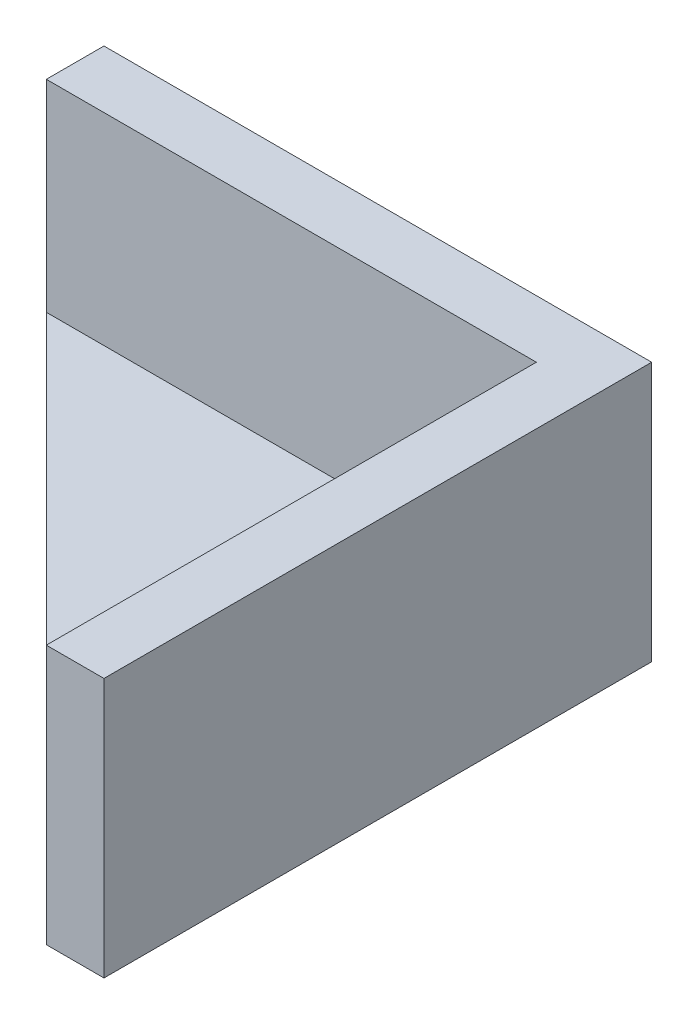
ISO-10303-21;
HEADER;
FILE_DESCRIPTION(('STEP AP214'),'2;1');
FILE_NAME('part.step','',(''),(''),'','','');
FILE_SCHEMA(('AUTOMOTIVE_DESIGN { 1 0 10303 214 1 1 1 1 }'));
ENDSEC;
DATA;
#1=APPLICATION_CONTEXT('core data for automotive mechanical design processes');
#2=APPLICATION_PROTOCOL_DEFINITION('international standard','automotive_design',2000,#1);
#3=PRODUCT_CONTEXT('',#1,'mechanical');
#4=PRODUCT('Part','Part','',(#3));
#5=PRODUCT_RELATED_PRODUCT_CATEGORY('part','',(#4));
#6=PRODUCT_DEFINITION_FORMATION('','',#4);
#7=PRODUCT_DEFINITION_CONTEXT('part definition',#1,'design');
#8=PRODUCT_DEFINITION('design','',#6,#7);
#9=PRODUCT_DEFINITION_SHAPE('','',#8);
#10=(LENGTH_UNIT() NAMED_UNIT(*) SI_UNIT(.MILLI.,.METRE.));
#11=(NAMED_UNIT(*) PLANE_ANGLE_UNIT() SI_UNIT($,.RADIAN.));
#12=(NAMED_UNIT(*) SI_UNIT($,.STERADIAN.) SOLID_ANGLE_UNIT());
#13=UNCERTAINTY_MEASURE_WITH_UNIT(LENGTH_MEASURE(1.E-05),#10,'distance_accuracy_value','');
#14=(GEOMETRIC_REPRESENTATION_CONTEXT(3) GLOBAL_UNCERTAINTY_ASSIGNED_CONTEXT((#13)) GLOBAL_UNIT_ASSIGNED_CONTEXT((#10,
#11,#12)) REPRESENTATION_CONTEXT('',''));
#15=CARTESIAN_POINT('',(0.,0.,0.));
#16=DIRECTION('',(0.,0.,1.));
#17=DIRECTION('',(1.,0.,0.));
#18=AXIS2_PLACEMENT_3D('',#15,#16,#17);
#19=CARTESIAN_POINT('',(0.,0.,4.));
#20=DIRECTION('',(0.,0.,-1.));
#21=DIRECTION('',(-1.,0.,0.));
#22=AXIS2_PLACEMENT_3D('',#19,#20,#21);
#23=PLANE('',#22);
#24=DIRECTION('',(-1.,0.,0.));
#25=VECTOR('',#24,1.);
#26=CARTESIAN_POINT('',(-19.,-5.,4.));
#27=LINE('',#26,#25);
#28=CARTESIAN_POINT('',(15.,-5.,4.));
#29=VERTEX_POINT('',#28);
#30=CARTESIAN_POINT('',(-19.,-5.,4.));
#31=VERTEX_POINT('',#30);
#32=EDGE_CURVE('E108',#29,#31,#27,.T.);
#33=ORIENTED_EDGE('',*,*,#32,.F.);
#34=DIRECTION('',(0.,-1.,0.));
#35=VECTOR('',#34,1.);
#36=CARTESIAN_POINT('',(15.,-5.,4.));
#37=LINE('',#36,#35);
#38=CARTESIAN_POINT('',(15.,9.,4.));
#39=VERTEX_POINT('',#38);
#40=EDGE_CURVE('E62',#39,#29,#37,.T.);
#41=ORIENTED_EDGE('',*,*,#40,.F.);
#42=DIRECTION('',(-1.,0.,0.));
#43=VECTOR('',#42,1.);
#44=CARTESIAN_POINT('',(-19.,9.,4.));
#45=LINE('',#44,#43);
#46=CARTESIAN_POINT('',(-19.,9.,4.));
#47=VERTEX_POINT('',#46);
#48=EDGE_CURVE('E137',#39,#47,#45,.T.);
#49=ORIENTED_EDGE('',*,*,#48,.T.);
#50=DIRECTION('',(0.,-1.,0.));
#51=VECTOR('',#50,1.);
#52=CARTESIAN_POINT('',(-19.,-9.,4.));
#53=LINE('',#52,#51);
#54=EDGE_CURVE('E140',#47,#31,#53,.T.);
#55=ORIENTED_EDGE('',*,*,#54,.T.);
#56=EDGE_LOOP('',(#33,#41,#49,#55));
#57=FACE_BOUND('',#56,.T.);
#58=ADVANCED_FACE('F39',(#57),#23,.F.);
#59=CARTESIAN_POINT('',(19.,-9.,4.));
#60=DIRECTION('',(-1.,0.,0.));
#61=DIRECTION('',(0.,0.,1.));
#62=AXIS2_PLACEMENT_3D('',#59,#60,#61);
#63=PLANE('',#62);
#64=DIRECTION('',(0.,1.,0.));
#65=VECTOR('',#64,1.);
#66=CARTESIAN_POINT('',(19.,-9.,0.));
#67=LINE('',#66,#65);
#68=CARTESIAN_POINT('',(19.,-9.,0.));
#69=VERTEX_POINT('',#68);
#70=CARTESIAN_POINT('',(19.,9.,0.));
#71=VERTEX_POINT('',#70);
#72=EDGE_CURVE('E131',#69,#71,#67,.T.);
#73=ORIENTED_EDGE('',*,*,#72,.T.);
#74=DIRECTION('',(0.,0.,-1.));
#75=VECTOR('',#74,1.);
#76=CARTESIAN_POINT('',(19.,9.,4.));
#77=LINE('',#76,#75);
#78=CARTESIAN_POINT('',(19.,9.,38.));
#79=VERTEX_POINT('',#78);
#80=EDGE_CURVE('E48',#79,#71,#77,.T.);
#81=ORIENTED_EDGE('',*,*,#80,.F.);
#82=DIRECTION('',(0.,1.,0.));
#83=VECTOR('',#82,1.);
#84=CARTESIAN_POINT('',(19.,9.,38.));
#85=LINE('',#84,#83);
#86=CARTESIAN_POINT('',(19.,-9.,38.));
#87=VERTEX_POINT('',#86);
#88=EDGE_CURVE('E127',#87,#79,#85,.T.);
#89=ORIENTED_EDGE('',*,*,#88,.F.);
#90=DIRECTION('',(0.,0.,-1.));
#91=VECTOR('',#90,1.);
#92=CARTESIAN_POINT('',(19.,-9.,4.));
#93=LINE('',#92,#91);
#94=EDGE_CURVE('E145',#87,#69,#93,.T.);
#95=ORIENTED_EDGE('',*,*,#94,.T.);
#96=EDGE_LOOP('',(#73,#81,#89,#95));
#97=FACE_BOUND('',#96,.T.);
#98=ADVANCED_FACE('F41',(#97),#63,.F.);
#99=CARTESIAN_POINT('',(-19.,9.,4.));
#100=DIRECTION('',(0.,-1.,0.));
#101=DIRECTION('',(0.,0.,-1.));
#102=AXIS2_PLACEMENT_3D('',#99,#100,#101);
#103=PLANE('',#102);
#104=DIRECTION('',(-1.,0.,0.));
#105=VECTOR('',#104,1.);
#106=CARTESIAN_POINT('',(-19.,9.,0.));
#107=LINE('',#106,#105);
#108=CARTESIAN_POINT('',(-19.,9.,0.));
#109=VERTEX_POINT('',#108);
#110=EDGE_CURVE('E149',#71,#109,#107,.T.);
#111=ORIENTED_EDGE('',*,*,#110,.T.);
#112=DIRECTION('',(0.,0.,-1.));
#113=VECTOR('',#112,1.);
#114=CARTESIAN_POINT('',(-19.,9.,4.));
#115=LINE('',#114,#113);
#116=EDGE_CURVE('E164',#47,#109,#115,.T.);
#117=ORIENTED_EDGE('',*,*,#116,.F.);
#118=ORIENTED_EDGE('',*,*,#48,.F.);
#119=DIRECTION('',(0.,0.,-1.));
#120=VECTOR('',#119,1.);
#121=CARTESIAN_POINT('',(15.,8.99999999999999,38.));
#122=LINE('',#121,#120);
#123=CARTESIAN_POINT('',(15.,8.99999999999999,38.));
#124=VERTEX_POINT('',#123);
#125=EDGE_CURVE('E126',#124,#39,#122,.T.);
#126=ORIENTED_EDGE('',*,*,#125,.F.);
#127=DIRECTION('',(-1.,0.,0.));
#128=VECTOR('',#127,1.);
#129=CARTESIAN_POINT('',(15.,8.99999999999999,38.));
#130=LINE('',#129,#128);
#131=EDGE_CURVE('E117',#79,#124,#130,.T.);
#132=ORIENTED_EDGE('',*,*,#131,.F.);
#133=ORIENTED_EDGE('',*,*,#80,.T.);
#134=EDGE_LOOP('',(#111,#117,#118,#126,#132,#133));
#135=FACE_BOUND('',#134,.T.);
#136=ADVANCED_FACE('F170',(#135),#103,.F.);
#137=CARTESIAN_POINT('',(-19.,-9.,4.));
#138=DIRECTION('',(1.,0.,0.));
#139=DIRECTION('',(0.,0.,-1.));
#140=AXIS2_PLACEMENT_3D('',#137,#138,#139);
#141=PLANE('',#140);
#142=DIRECTION('',(0.,0.,-1.));
#143=VECTOR('',#142,1.);
#144=CARTESIAN_POINT('',(-19.,-9.,4.));
#145=LINE('',#144,#143);
#146=CARTESIAN_POINT('',(-19.,-9.,4.));
#147=VERTEX_POINT('',#146);
#148=CARTESIAN_POINT('',(-19.,-9.,0.));
#149=VERTEX_POINT('',#148);
#150=EDGE_CURVE('E161',#147,#149,#145,.T.);
#151=ORIENTED_EDGE('',*,*,#150,.F.);
#152=DIRECTION('',(0.,1.,0.));
#153=VECTOR('',#152,1.);
#154=CARTESIAN_POINT('',(-19.,-39.,4.));
#155=LINE('',#154,#153);
#156=EDGE_CURVE('E110',#147,#31,#155,.T.);
#157=ORIENTED_EDGE('',*,*,#156,.T.);
#158=ORIENTED_EDGE('',*,*,#54,.F.);
#159=ORIENTED_EDGE('',*,*,#116,.T.);
#160=DIRECTION('',(0.,-1.,0.));
#161=VECTOR('',#160,1.);
#162=CARTESIAN_POINT('',(-19.,-9.,0.));
#163=LINE('',#162,#161);
#164=EDGE_CURVE('E152',#109,#149,#163,.T.);
#165=ORIENTED_EDGE('',*,*,#164,.T.);
#166=EDGE_LOOP('',(#151,#157,#158,#159,#165));
#167=FACE_BOUND('',#166,.T.);
#168=ADVANCED_FACE('F182',(#167),#141,.F.);
#169=CARTESIAN_POINT('',(-19.,-9.,4.));
#170=DIRECTION('',(0.,1.,0.));
#171=DIRECTION('',(0.,0.,1.));
#172=AXIS2_PLACEMENT_3D('',#169,#170,#171);
#173=PLANE('',#172);
#174=DIRECTION('',(1.,0.,0.));
#175=VECTOR('',#174,1.);
#176=CARTESIAN_POINT('',(-19.,-9.,38.));
#177=LINE('',#176,#175);
#178=CARTESIAN_POINT('',(15.,-9.,38.));
#179=VERTEX_POINT('',#178);
#180=EDGE_CURVE('E122',#179,#87,#177,.T.);
#181=ORIENTED_EDGE('',*,*,#180,.F.);
#182=DIRECTION('',(-0.707106781186548,0.,-0.707106781186548));
#183=VECTOR('',#182,1.);
#184=CARTESIAN_POINT('',(-19.,-9.,4.));
#185=LINE('',#184,#183);
#186=EDGE_CURVE('E55',#179,#147,#185,.T.);
#187=ORIENTED_EDGE('',*,*,#186,.T.);
#188=ORIENTED_EDGE('',*,*,#150,.T.);
#189=DIRECTION('',(1.,0.,0.));
#190=VECTOR('',#189,1.);
#191=CARTESIAN_POINT('',(-19.,-9.,0.));
#192=LINE('',#191,#190);
#193=EDGE_CURVE('E141',#149,#69,#192,.T.);
#194=ORIENTED_EDGE('',*,*,#193,.T.);
#195=ORIENTED_EDGE('',*,*,#94,.F.);
#196=EDGE_LOOP('',(#181,#187,#188,#194,#195));
#197=FACE_BOUND('',#196,.T.);
#198=ADVANCED_FACE('F195',(#197),#173,.F.);
#199=CARTESIAN_POINT('',(0.,0.,0.));
#200=DIRECTION('',(0.,0.,-1.));
#201=DIRECTION('',(-1.,0.,0.));
#202=AXIS2_PLACEMENT_3D('',#199,#200,#201);
#203=PLANE('',#202);
#204=ORIENTED_EDGE('',*,*,#72,.F.);
#205=ORIENTED_EDGE('',*,*,#193,.F.);
#206=ORIENTED_EDGE('',*,*,#164,.F.);
#207=ORIENTED_EDGE('',*,*,#110,.F.);
#208=EDGE_LOOP('',(#204,#205,#206,#207));
#209=FACE_BOUND('',#208,.T.);
#210=ADVANCED_FACE('F178',(#209),#203,.T.);
#211=CARTESIAN_POINT('',(15.,-5.,38.));
#212=DIRECTION('',(1.,0.,0.));
#213=DIRECTION('',(0.,1.,0.));
#214=AXIS2_PLACEMENT_3D('',#211,#212,#213);
#215=PLANE('',#214);
#216=ORIENTED_EDGE('',*,*,#40,.T.);
#217=DIRECTION('',(0.,0.,-1.));
#218=VECTOR('',#217,1.);
#219=CARTESIAN_POINT('',(15.,-5.,38.));
#220=LINE('',#219,#218);
#221=CARTESIAN_POINT('',(15.,-5.,38.));
#222=VERTEX_POINT('',#221);
#223=EDGE_CURVE('E107',#222,#29,#220,.T.);
#224=ORIENTED_EDGE('',*,*,#223,.F.);
#225=DIRECTION('',(0.,-1.,0.));
#226=VECTOR('',#225,1.);
#227=CARTESIAN_POINT('',(15.,-5.,38.));
#228=LINE('',#227,#226);
#229=EDGE_CURVE('E113',#124,#222,#228,.T.);
#230=ORIENTED_EDGE('',*,*,#229,.F.);
#231=ORIENTED_EDGE('',*,*,#125,.T.);
#232=EDGE_LOOP('',(#216,#224,#230,#231));
#233=FACE_BOUND('',#232,.T.);
#234=ADVANCED_FACE('F124',(#233),#215,.F.);
#235=CARTESIAN_POINT('',(-19.,-5.,38.));
#236=DIRECTION('',(0.,-1.,0.));
#237=DIRECTION('',(0.,0.,-1.));
#238=AXIS2_PLACEMENT_3D('',#235,#236,#237);
#239=PLANE('',#238);
#240=ORIENTED_EDGE('',*,*,#32,.T.);
#241=DIRECTION('',(-0.707106781186547,0.,-0.707106781186547));
#242=VECTOR('',#241,1.);
#243=CARTESIAN_POINT('',(15.,-5.,38.));
#244=LINE('',#243,#242);
#245=EDGE_CURVE('E97',#222,#31,#244,.T.);
#246=ORIENTED_EDGE('',*,*,#245,.F.);
#247=ORIENTED_EDGE('',*,*,#223,.T.);
#248=EDGE_LOOP('',(#240,#246,#247));
#249=FACE_BOUND('',#248,.T.);
#250=ADVANCED_FACE('F105',(#249),#239,.F.);
#251=CARTESIAN_POINT('',(0.,0.,38.));
#252=DIRECTION('',(0.,0.,-1.));
#253=DIRECTION('',(-1.,0.,0.));
#254=AXIS2_PLACEMENT_3D('',#251,#252,#253);
#255=PLANE('',#254);
#256=ORIENTED_EDGE('',*,*,#229,.T.);
#257=DIRECTION('',(0.,-1.,0.));
#258=VECTOR('',#257,1.);
#259=CARTESIAN_POINT('',(15.,0.,38.));
#260=LINE('',#259,#258);
#261=EDGE_CURVE('E11',#222,#179,#260,.T.);
#262=ORIENTED_EDGE('',*,*,#261,.T.);
#263=ORIENTED_EDGE('',*,*,#180,.T.);
#264=ORIENTED_EDGE('',*,*,#88,.T.);
#265=ORIENTED_EDGE('',*,*,#131,.T.);
#266=EDGE_LOOP('',(#256,#262,#263,#264,#265));
#267=FACE_BOUND('',#266,.T.);
#268=ADVANCED_FACE('F114',(#267),#255,.F.);
#269=CARTESIAN_POINT('',(15.,-39.,38.));
#270=DIRECTION('',(0.707106781186548,0.,-0.707106781186548));
#271=DIRECTION('',(-0.707106781186548,0.,-0.707106781186548));
#272=AXIS2_PLACEMENT_3D('',#269,#270,#271);
#273=PLANE('',#272);
#274=ORIENTED_EDGE('',*,*,#261,.F.);
#275=ORIENTED_EDGE('',*,*,#245,.T.);
#276=ORIENTED_EDGE('',*,*,#156,.F.);
#277=ORIENTED_EDGE('',*,*,#186,.F.);
#278=EDGE_LOOP('',(#274,#275,#276,#277));
#279=FACE_BOUND('',#278,.T.);
#280=ADVANCED_FACE('F96',(#279),#273,.F.);
#281=CLOSED_SHELL('',(#58,#98,#136,#168,#198,#210,#234,#250,#268,#280));
#282=MANIFOLD_SOLID_BREP('B2',#281);
#283=ADVANCED_BREP_SHAPE_REPRESENTATION('',(#18,#282),#14);
#284=SHAPE_DEFINITION_REPRESENTATION(#9,#283);
ENDSEC;
END-ISO-10303-21;
